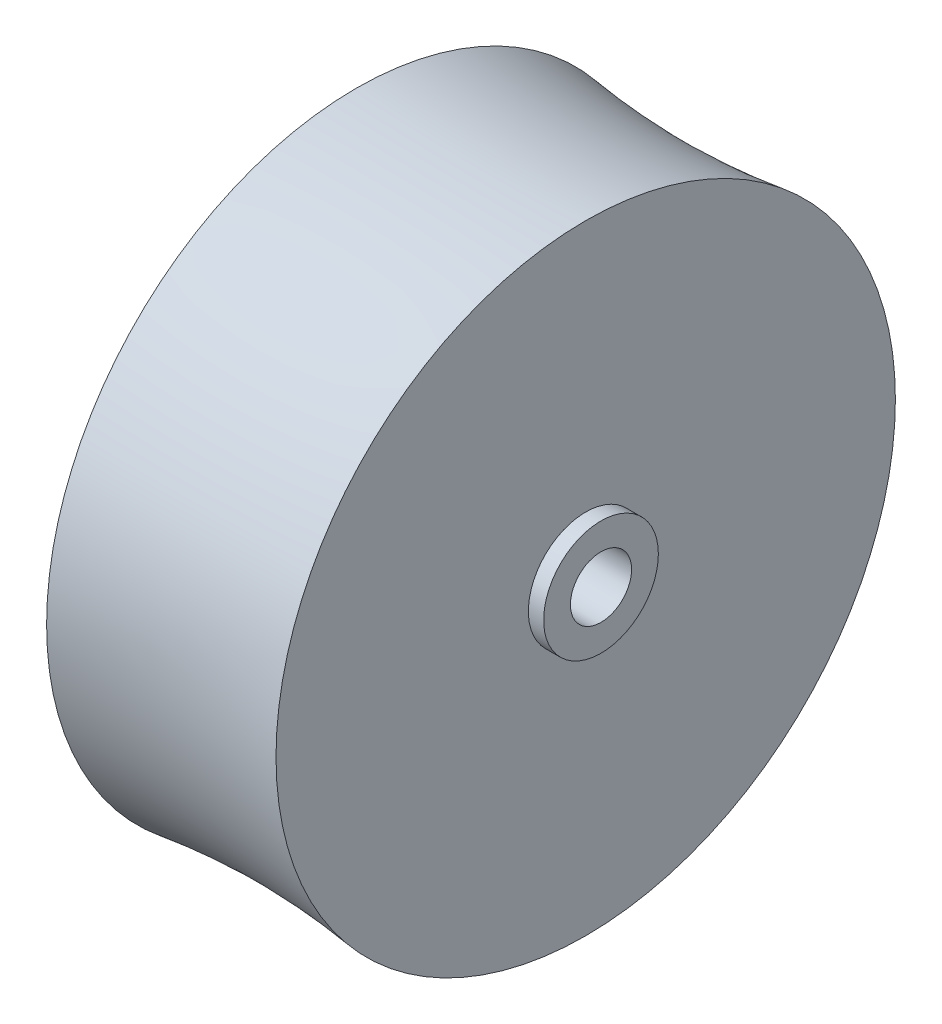
ISO-10303-21;
HEADER;
FILE_DESCRIPTION(('STEP AP214'),'2;1');
FILE_NAME('part.step','',(''),(''),'','','');
FILE_SCHEMA(('AUTOMOTIVE_DESIGN { 1 0 10303 214 1 1 1 1 }'));
ENDSEC;
DATA;
#1=APPLICATION_CONTEXT('core data for automotive mechanical design processes');
#2=APPLICATION_PROTOCOL_DEFINITION('international standard','automotive_design',2000,#1);
#3=PRODUCT_CONTEXT('',#1,'mechanical');
#4=PRODUCT('Part','Part','',(#3));
#5=PRODUCT_RELATED_PRODUCT_CATEGORY('part','',(#4));
#6=PRODUCT_DEFINITION_FORMATION('','',#4);
#7=PRODUCT_DEFINITION_CONTEXT('part definition',#1,'design');
#8=PRODUCT_DEFINITION('design','',#6,#7);
#9=PRODUCT_DEFINITION_SHAPE('','',#8);
#10=(LENGTH_UNIT() NAMED_UNIT(*) SI_UNIT(.MILLI.,.METRE.));
#11=(NAMED_UNIT(*) PLANE_ANGLE_UNIT() SI_UNIT($,.RADIAN.));
#12=(NAMED_UNIT(*) SI_UNIT($,.STERADIAN.) SOLID_ANGLE_UNIT());
#13=UNCERTAINTY_MEASURE_WITH_UNIT(LENGTH_MEASURE(1.E-05),#10,'distance_accuracy_value','');
#14=(GEOMETRIC_REPRESENTATION_CONTEXT(3) GLOBAL_UNCERTAINTY_ASSIGNED_CONTEXT((#13)) GLOBAL_UNIT_ASSIGNED_CONTEXT((#10,
#11,#12)) REPRESENTATION_CONTEXT('',''));
#15=CARTESIAN_POINT('',(0.,0.,0.));
#16=DIRECTION('',(0.,0.,1.));
#17=DIRECTION('',(1.,0.,0.));
#18=AXIS2_PLACEMENT_3D('',#15,#16,#17);
#19=CARTESIAN_POINT('',(-32.,40.5,0.));
#20=CARTESIAN_POINT('',(-17.,38.5,0.));
#21=CARTESIAN_POINT('',(-1.99999999999999,40.5,0.));
#22=B_SPLINE_CURVE_WITH_KNOTS('',2,(#19,#20,#21),.UNSPECIFIED.,.F.,.F.,(3,3),(0.,1.),.UNSPECIFIED.);
#23=CARTESIAN_POINT('',(0.,0.,0.));
#24=DIRECTION('',(1.,0.,0.));
#25=AXIS1_PLACEMENT('',#23,#24);
#26=SURFACE_OF_REVOLUTION('',#22,#25);
#27=CARTESIAN_POINT('',(-2.00000000000001,0.,0.));
#28=DIRECTION('',(1.,0.,0.));
#29=DIRECTION('',(0.,0.,-1.));
#30=AXIS2_PLACEMENT_3D('',#27,#28,#29);
#31=CIRCLE('',#30,40.5);
#32=CARTESIAN_POINT('',(-2.00000000000001,0.,-40.5));
#33=VERTEX_POINT('',#32);
#34=EDGE_CURVE('E81',#33,#33,#31,.T.);
#35=ORIENTED_EDGE('',*,*,#34,.F.);
#36=EDGE_LOOP('',(#35));
#37=FACE_BOUND('',#36,.T.);
#38=CARTESIAN_POINT('',(-32.,0.,0.));
#39=DIRECTION('',(1.,0.,0.));
#40=DIRECTION('',(0.,0.,-1.));
#41=AXIS2_PLACEMENT_3D('',#38,#39,#40);
#42=CIRCLE('',#41,40.5);
#43=CARTESIAN_POINT('',(-32.,0.,-40.5));
#44=VERTEX_POINT('',#43);
#45=EDGE_CURVE('E10',#44,#44,#42,.T.);
#46=ORIENTED_EDGE('',*,*,#45,.T.);
#47=EDGE_LOOP('',(#46));
#48=FACE_BOUND('',#47,.T.);
#49=ADVANCED_FACE('F45',(#37,#48),#26,.T.);
#50=CARTESIAN_POINT('',(-32.,0.,0.));
#51=DIRECTION('',(-1.,0.,0.));
#52=DIRECTION('',(0.,0.,1.));
#53=AXIS2_PLACEMENT_3D('',#50,#51,#52);
#54=PLANE('',#53);
#55=CARTESIAN_POINT('',(-32.,0.,0.));
#56=DIRECTION('',(1.,0.,0.));
#57=DIRECTION('',(0.,0.,-1.));
#58=AXIS2_PLACEMENT_3D('',#55,#56,#57);
#59=CIRCLE('',#58,7.5);
#60=CARTESIAN_POINT('',(-32.,0.,-7.5));
#61=VERTEX_POINT('',#60);
#62=EDGE_CURVE('E53',#61,#61,#59,.T.);
#63=ORIENTED_EDGE('',*,*,#62,.T.);
#64=EDGE_LOOP('',(#63));
#65=FACE_BOUND('',#64,.T.);
#66=ORIENTED_EDGE('',*,*,#45,.F.);
#67=EDGE_LOOP('',(#66));
#68=FACE_BOUND('',#67,.T.);
#69=ADVANCED_FACE('F95',(#65,#68),#54,.T.);
#70=CARTESIAN_POINT('',(0.,0.,0.));
#71=DIRECTION('',(1.,0.,0.));
#72=DIRECTION('',(0.,0.,-1.));
#73=AXIS2_PLACEMENT_3D('',#70,#71,#72);
#74=CYLINDRICAL_SURFACE('',#73,7.5);
#75=CARTESIAN_POINT('',(-34.,0.,0.));
#76=DIRECTION('',(1.,0.,0.));
#77=DIRECTION('',(0.,0.,-1.));
#78=AXIS2_PLACEMENT_3D('',#75,#76,#77);
#79=CIRCLE('',#78,7.5);
#80=CARTESIAN_POINT('',(-34.,0.,-7.5));
#81=VERTEX_POINT('',#80);
#82=EDGE_CURVE('E58',#81,#81,#79,.T.);
#83=ORIENTED_EDGE('',*,*,#82,.T.);
#84=EDGE_LOOP('',(#83));
#85=FACE_BOUND('',#84,.T.);
#86=ORIENTED_EDGE('',*,*,#62,.F.);
#87=EDGE_LOOP('',(#86));
#88=FACE_BOUND('',#87,.T.);
#89=ADVANCED_FACE('F99',(#85,#88),#74,.T.);
#90=CARTESIAN_POINT('',(-34.,0.,0.));
#91=DIRECTION('',(1.,0.,0.));
#92=DIRECTION('',(0.,0.,-1.));
#93=AXIS2_PLACEMENT_3D('',#90,#91,#92);
#94=PLANE('',#93);
#95=ORIENTED_EDGE('',*,*,#82,.F.);
#96=EDGE_LOOP('',(#95));
#97=FACE_BOUND('',#96,.T.);
#98=CARTESIAN_POINT('',(-34.,0.,0.));
#99=DIRECTION('',(1.,0.,0.));
#100=DIRECTION('',(0.,0.,-1.));
#101=AXIS2_PLACEMENT_3D('',#98,#99,#100);
#102=CIRCLE('',#101,4.);
#103=CARTESIAN_POINT('',(-34.,0.,-4.));
#104=VERTEX_POINT('',#103);
#105=EDGE_CURVE('E63',#104,#104,#102,.T.);
#106=ORIENTED_EDGE('',*,*,#105,.T.);
#107=EDGE_LOOP('',(#106));
#108=FACE_BOUND('',#107,.T.);
#109=ADVANCED_FACE('F103',(#97,#108),#94,.F.);
#110=CARTESIAN_POINT('',(0.,0.,0.));
#111=DIRECTION('',(1.,0.,0.));
#112=DIRECTION('',(0.,0.,-1.));
#113=AXIS2_PLACEMENT_3D('',#110,#111,#112);
#114=CYLINDRICAL_SURFACE('',#113,4.);
#115=CARTESIAN_POINT('',(0.,0.,0.));
#116=DIRECTION('',(1.,0.,0.));
#117=DIRECTION('',(0.,0.,-1.));
#118=AXIS2_PLACEMENT_3D('',#115,#116,#117);
#119=CIRCLE('',#118,4.);
#120=CARTESIAN_POINT('',(0.,0.,-4.));
#121=VERTEX_POINT('',#120);
#122=EDGE_CURVE('E69',#121,#121,#119,.T.);
#123=ORIENTED_EDGE('',*,*,#122,.T.);
#124=EDGE_LOOP('',(#123));
#125=FACE_BOUND('',#124,.T.);
#126=ORIENTED_EDGE('',*,*,#105,.F.);
#127=EDGE_LOOP('',(#126));
#128=FACE_BOUND('',#127,.T.);
#129=ADVANCED_FACE('F110',(#125,#128),#114,.F.);
#130=CARTESIAN_POINT('',(0.,0.,0.));
#131=DIRECTION('',(1.,0.,0.));
#132=DIRECTION('',(0.,0.,-1.));
#133=AXIS2_PLACEMENT_3D('',#130,#131,#132);
#134=PLANE('',#133);
#135=CARTESIAN_POINT('',(0.,0.,0.));
#136=DIRECTION('',(1.,0.,0.));
#137=DIRECTION('',(0.,0.,-1.));
#138=AXIS2_PLACEMENT_3D('',#135,#136,#137);
#139=CIRCLE('',#138,7.5);
#140=CARTESIAN_POINT('',(0.,0.,-7.5));
#141=VERTEX_POINT('',#140);
#142=EDGE_CURVE('E73',#141,#141,#139,.T.);
#143=ORIENTED_EDGE('',*,*,#142,.T.);
#144=EDGE_LOOP('',(#143));
#145=FACE_BOUND('',#144,.T.);
#146=ORIENTED_EDGE('',*,*,#122,.F.);
#147=EDGE_LOOP('',(#146));
#148=FACE_BOUND('',#147,.T.);
#149=ADVANCED_FACE('F114',(#145,#148),#134,.T.);
#150=CARTESIAN_POINT('',(0.,0.,0.));
#151=DIRECTION('',(1.,0.,0.));
#152=DIRECTION('',(0.,0.,-1.));
#153=AXIS2_PLACEMENT_3D('',#150,#151,#152);
#154=CYLINDRICAL_SURFACE('',#153,7.5);
#155=ORIENTED_EDGE('',*,*,#142,.F.);
#156=EDGE_LOOP('',(#155));
#157=FACE_BOUND('',#156,.T.);
#158=CARTESIAN_POINT('',(-2.00000000000001,0.,0.));
#159=DIRECTION('',(1.,0.,0.));
#160=DIRECTION('',(0.,0.,-1.));
#161=AXIS2_PLACEMENT_3D('',#158,#159,#160);
#162=CIRCLE('',#161,7.5);
#163=CARTESIAN_POINT('',(-2.00000000000001,0.,-7.5));
#164=VERTEX_POINT('',#163);
#165=EDGE_CURVE('E77',#164,#164,#162,.T.);
#166=ORIENTED_EDGE('',*,*,#165,.T.);
#167=EDGE_LOOP('',(#166));
#168=FACE_BOUND('',#167,.T.);
#169=ADVANCED_FACE('F118',(#157,#168),#154,.T.);
#170=CARTESIAN_POINT('',(-2.00000000000001,0.,0.));
#171=DIRECTION('',(-1.,0.,0.));
#172=DIRECTION('',(0.,0.,1.));
#173=AXIS2_PLACEMENT_3D('',#170,#171,#172);
#174=PLANE('',#173);
#175=ORIENTED_EDGE('',*,*,#165,.F.);
#176=EDGE_LOOP('',(#175));
#177=FACE_BOUND('',#176,.T.);
#178=ORIENTED_EDGE('',*,*,#34,.T.);
#179=EDGE_LOOP('',(#178));
#180=FACE_BOUND('',#179,.T.);
#181=ADVANCED_FACE('F92',(#177,#180),#174,.F.);
#182=CLOSED_SHELL('',(#49,#69,#89,#109,#129,#149,#169,#181));
#183=MANIFOLD_SOLID_BREP('B2',#182);
#184=ADVANCED_BREP_SHAPE_REPRESENTATION('',(#18,#183),#14);
#185=SHAPE_DEFINITION_REPRESENTATION(#9,#184);
ENDSEC;
END-ISO-10303-21;
